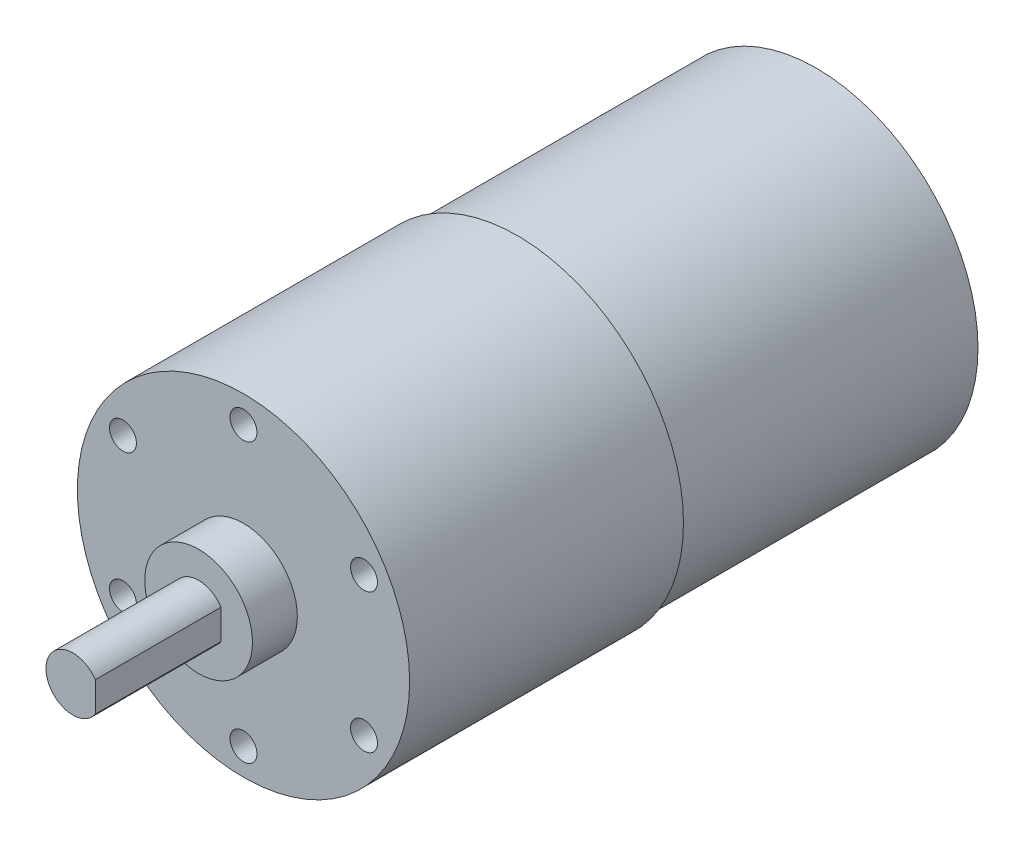
ISO-10303-21;
HEADER;
FILE_DESCRIPTION(('STEP AP214'),'2;1');
FILE_NAME('part.step','',(''),(''),'','','');
FILE_SCHEMA(('AUTOMOTIVE_DESIGN { 1 0 10303 214 1 1 1 1 }'));
ENDSEC;
DATA;
#1=APPLICATION_CONTEXT('core data for automotive mechanical design processes');
#2=APPLICATION_PROTOCOL_DEFINITION('international standard','automotive_design',2000,#1);
#3=PRODUCT_CONTEXT('',#1,'mechanical');
#4=PRODUCT('Part','Part','',(#3));
#5=PRODUCT_RELATED_PRODUCT_CATEGORY('part','',(#4));
#6=PRODUCT_DEFINITION_FORMATION('','',#4);
#7=PRODUCT_DEFINITION_CONTEXT('part definition',#1,'design');
#8=PRODUCT_DEFINITION('design','',#6,#7);
#9=PRODUCT_DEFINITION_SHAPE('','',#8);
#10=(LENGTH_UNIT() NAMED_UNIT(*) SI_UNIT(.MILLI.,.METRE.));
#11=(NAMED_UNIT(*) PLANE_ANGLE_UNIT() SI_UNIT($,.RADIAN.));
#12=(NAMED_UNIT(*) SI_UNIT($,.STERADIAN.) SOLID_ANGLE_UNIT());
#13=UNCERTAINTY_MEASURE_WITH_UNIT(LENGTH_MEASURE(1.E-05),#10,'distance_accuracy_value','');
#14=(GEOMETRIC_REPRESENTATION_CONTEXT(3) GLOBAL_UNCERTAINTY_ASSIGNED_CONTEXT((#13)) GLOBAL_UNIT_ASSIGNED_CONTEXT((#10,
#11,#12)) REPRESENTATION_CONTEXT('',''));
#15=CARTESIAN_POINT('',(0.,0.,0.));
#16=DIRECTION('',(0.,0.,1.));
#17=DIRECTION('',(1.,0.,0.));
#18=AXIS2_PLACEMENT_3D('',#15,#16,#17);
#19=CARTESIAN_POINT('',(0.,0.,0.));
#20=DIRECTION('',(0.,0.,-1.));
#21=DIRECTION('',(-1.,0.,0.));
#22=AXIS2_PLACEMENT_3D('',#19,#20,#21);
#23=PLANE('',#22);
#24=CARTESIAN_POINT('',(0.,0.,0.));
#25=DIRECTION('',(0.,0.,1.));
#26=DIRECTION('',(1.,0.,0.));
#27=AXIS2_PLACEMENT_3D('',#24,#25,#26);
#28=CIRCLE('',#27,3.);
#29=CARTESIAN_POINT('',(2.5,1.6583123951777,0.));
#30=VERTEX_POINT('',#29);
#31=CARTESIAN_POINT('',(2.5,-1.6583123951777,0.));
#32=VERTEX_POINT('',#31);
#33=EDGE_CURVE('E11',#30,#32,#28,.T.);
#34=ORIENTED_EDGE('',*,*,#33,.T.);
#35=DIRECTION('',(0.,1.,0.));
#36=VECTOR('',#35,1.);
#37=CARTESIAN_POINT('',(2.5,-18.5,0.));
#38=LINE('',#37,#36);
#39=EDGE_CURVE('E68',#32,#30,#38,.T.);
#40=ORIENTED_EDGE('',*,*,#39,.T.);
#41=EDGE_LOOP('',(#34,#40));
#42=FACE_BOUND('',#41,.T.);
#43=ADVANCED_FACE('F39',(#42),#23,.F.);
#44=CARTESIAN_POINT('',(0.,0.,0.));
#45=DIRECTION('',(0.,0.,1.));
#46=DIRECTION('',(1.,0.,0.));
#47=AXIS2_PLACEMENT_3D('',#44,#45,#46);
#48=CYLINDRICAL_SURFACE('',#47,3.);
#49=CARTESIAN_POINT('',(0.,0.,-14.));
#50=DIRECTION('',(0.,0.,1.));
#51=DIRECTION('',(1.,0.,0.));
#52=AXIS2_PLACEMENT_3D('',#49,#50,#51);
#53=CIRCLE('',#52,3.);
#54=CARTESIAN_POINT('',(2.5,1.6583123951777,-14.));
#55=VERTEX_POINT('',#54);
#56=CARTESIAN_POINT('',(2.5,-1.6583123951777,-14.));
#57=VERTEX_POINT('',#56);
#58=EDGE_CURVE('E46',#55,#57,#53,.T.);
#59=ORIENTED_EDGE('',*,*,#58,.T.);
#60=DIRECTION('',(0.,0.,1.));
#61=VECTOR('',#60,1.);
#62=CARTESIAN_POINT('',(2.5,-1.6583123951777,0.));
#63=LINE('',#62,#61);
#64=EDGE_CURVE('E66',#57,#32,#63,.T.);
#65=ORIENTED_EDGE('',*,*,#64,.T.);
#66=ORIENTED_EDGE('',*,*,#33,.F.);
#67=DIRECTION('',(0.,0.,1.));
#68=VECTOR('',#67,1.);
#69=CARTESIAN_POINT('',(2.5,1.6583123951777,0.));
#70=LINE('',#69,#68);
#71=EDGE_CURVE('E59',#30,#55,#70,.F.);
#72=ORIENTED_EDGE('',*,*,#71,.T.);
#73=EDGE_LOOP('',(#59,#65,#66,#72));
#74=FACE_BOUND('',#73,.T.);
#75=ADVANCED_FACE('F72',(#74),#48,.T.);
#76=CARTESIAN_POINT('',(0.,3.,-14.));
#77=DIRECTION('',(0.,0.,-1.));
#78=DIRECTION('',(-1.,0.,0.));
#79=AXIS2_PLACEMENT_3D('',#76,#77,#78);
#80=PLANE('',#79);
#81=ORIENTED_EDGE('',*,*,#58,.F.);
#82=DIRECTION('',(0.,1.,0.));
#83=VECTOR('',#82,1.);
#84=CARTESIAN_POINT('',(2.5,-18.5,-14.));
#85=LINE('',#84,#83);
#86=EDGE_CURVE('E52',#57,#55,#85,.T.);
#87=ORIENTED_EDGE('',*,*,#86,.F.);
#88=EDGE_LOOP('',(#81,#87));
#89=FACE_BOUND('',#88,.T.);
#90=CARTESIAN_POINT('',(0.,0.,-14.));
#91=DIRECTION('',(0.,0.,1.));
#92=DIRECTION('',(1.,0.,0.));
#93=AXIS2_PLACEMENT_3D('',#90,#91,#92);
#94=CIRCLE('',#93,6.);
#95=CARTESIAN_POINT('',(6.,0.,-14.));
#96=VERTEX_POINT('',#95);
#97=EDGE_CURVE('E76',#96,#96,#94,.T.);
#98=ORIENTED_EDGE('',*,*,#97,.T.);
#99=EDGE_LOOP('',(#98));
#100=FACE_BOUND('',#99,.T.);
#101=ADVANCED_FACE('F74',(#89,#100),#80,.F.);
#102=CARTESIAN_POINT('',(0.,0.,0.));
#103=DIRECTION('',(0.,0.,1.));
#104=DIRECTION('',(1.,0.,0.));
#105=AXIS2_PLACEMENT_3D('',#102,#103,#104);
#106=CYLINDRICAL_SURFACE('',#105,6.);
#107=ORIENTED_EDGE('',*,*,#97,.F.);
#108=EDGE_LOOP('',(#107));
#109=FACE_BOUND('',#108,.T.);
#110=CARTESIAN_POINT('',(0.,0.,-19.));
#111=DIRECTION('',(0.,0.,1.));
#112=DIRECTION('',(1.,0.,0.));
#113=AXIS2_PLACEMENT_3D('',#110,#111,#112);
#114=CIRCLE('',#113,6.);
#115=CARTESIAN_POINT('',(6.,0.,-19.));
#116=VERTEX_POINT('',#115);
#117=EDGE_CURVE('E78',#116,#116,#114,.T.);
#118=ORIENTED_EDGE('',*,*,#117,.T.);
#119=EDGE_LOOP('',(#118));
#120=FACE_BOUND('',#119,.T.);
#121=ADVANCED_FACE('F140',(#109,#120),#106,.T.);
#122=CARTESIAN_POINT('',(0.,6.,-19.));
#123=DIRECTION('',(0.,0.,-1.));
#124=DIRECTION('',(-1.,0.,0.));
#125=AXIS2_PLACEMENT_3D('',#122,#123,#124);
#126=PLANE('',#125);
#127=CARTESIAN_POINT('',(0.,15.5,-19.));
#128=DIRECTION('',(0.,0.,1.));
#129=DIRECTION('',(1.,0.,0.));
#130=AXIS2_PLACEMENT_3D('',#127,#128,#129);
#131=CIRCLE('',#130,1.5);
#132=CARTESIAN_POINT('',(1.5,15.5,-19.));
#133=VERTEX_POINT('',#132);
#134=EDGE_CURVE('E121',#133,#133,#131,.T.);
#135=ORIENTED_EDGE('',*,*,#134,.F.);
#136=EDGE_LOOP('',(#135));
#137=FACE_BOUND('',#136,.T.);
#138=CARTESIAN_POINT('',(-13.4233937586579,7.74999999999847,-19.));
#139=DIRECTION('',(0.,0.,1.));
#140=DIRECTION('',(1.,0.,0.));
#141=AXIS2_PLACEMENT_3D('',#138,#139,#140);
#142=CIRCLE('',#141,1.50000000000147);
#143=CARTESIAN_POINT('',(-11.9233937586565,7.74999999999847,-19.));
#144=VERTEX_POINT('',#143);
#145=EDGE_CURVE('E122',#144,#144,#142,.T.);
#146=ORIENTED_EDGE('',*,*,#145,.F.);
#147=EDGE_LOOP('',(#146));
#148=FACE_BOUND('',#147,.T.);
#149=CARTESIAN_POINT('',(-13.4233937586562,-7.75000000000153,-19.));
#150=DIRECTION('',(0.,0.,1.));
#151=DIRECTION('',(1.,0.,0.));
#152=AXIS2_PLACEMENT_3D('',#149,#150,#151);
#153=CIRCLE('',#152,1.50000000000311);
#154=CARTESIAN_POINT('',(-11.923393758653,-7.75000000000153,-19.));
#155=VERTEX_POINT('',#154);
#156=EDGE_CURVE('E96',#155,#155,#153,.T.);
#157=ORIENTED_EDGE('',*,*,#156,.F.);
#158=EDGE_LOOP('',(#157));
#159=FACE_BOUND('',#158,.T.);
#160=CARTESIAN_POINT('',(3.51859736175406E-12,-15.5,-19.));
#161=DIRECTION('',(0.,0.,1.));
#162=DIRECTION('',(1.,0.,0.));
#163=AXIS2_PLACEMENT_3D('',#160,#161,#162);
#164=CIRCLE('',#163,1.50000000000347);
#165=CARTESIAN_POINT('',(1.50000000000699,-15.5,-19.));
#166=VERTEX_POINT('',#165);
#167=EDGE_CURVE('E103',#166,#166,#164,.T.);
#168=ORIENTED_EDGE('',*,*,#167,.F.);
#169=EDGE_LOOP('',(#168));
#170=FACE_BOUND('',#169,.T.);
#171=CARTESIAN_POINT('',(13.4233937586614,-7.74999999999847,-19.));
#172=DIRECTION('',(0.,0.,1.));
#173=DIRECTION('',(1.,0.,0.));
#174=AXIS2_PLACEMENT_3D('',#171,#172,#173);
#175=CIRCLE('',#174,1.50000000000215);
#176=CARTESIAN_POINT('',(14.9233937586636,-7.74999999999847,-19.));
#177=VERTEX_POINT('',#176);
#178=EDGE_CURVE('E109',#177,#177,#175,.T.);
#179=ORIENTED_EDGE('',*,*,#178,.F.);
#180=EDGE_LOOP('',(#179));
#181=FACE_BOUND('',#180,.T.);
#182=CARTESIAN_POINT('',(13.4233937586597,7.75000000000153,-19.));
#183=DIRECTION('',(0.,0.,1.));
#184=DIRECTION('',(1.,0.,0.));
#185=AXIS2_PLACEMENT_3D('',#182,#183,#184);
#186=CIRCLE('',#185,1.50000000000044);
#187=CARTESIAN_POINT('',(14.9233937586601,7.75000000000153,-19.));
#188=VERTEX_POINT('',#187);
#189=EDGE_CURVE('E115',#188,#188,#186,.T.);
#190=ORIENTED_EDGE('',*,*,#189,.F.);
#191=EDGE_LOOP('',(#190));
#192=FACE_BOUND('',#191,.T.);
#193=ORIENTED_EDGE('',*,*,#117,.F.);
#194=EDGE_LOOP('',(#193));
#195=FACE_BOUND('',#194,.T.);
#196=CARTESIAN_POINT('',(0.,0.,-19.));
#197=DIRECTION('',(0.,0.,1.));
#198=DIRECTION('',(1.,0.,0.));
#199=AXIS2_PLACEMENT_3D('',#196,#197,#198);
#200=CIRCLE('',#199,18.5);
#201=CARTESIAN_POINT('',(18.5,0.,-19.));
#202=VERTEX_POINT('',#201);
#203=EDGE_CURVE('E83',#202,#202,#200,.T.);
#204=ORIENTED_EDGE('',*,*,#203,.T.);
#205=EDGE_LOOP('',(#204));
#206=FACE_BOUND('',#205,.T.);
#207=ADVANCED_FACE('F145',(#137,#148,#159,#170,#181,#192,#195,#206),#126,.F.);
#208=CARTESIAN_POINT('',(0.,0.,0.));
#209=DIRECTION('',(0.,0.,1.));
#210=DIRECTION('',(1.,0.,0.));
#211=AXIS2_PLACEMENT_3D('',#208,#209,#210);
#212=CYLINDRICAL_SURFACE('',#211,18.5);
#213=ORIENTED_EDGE('',*,*,#203,.F.);
#214=EDGE_LOOP('',(#213));
#215=FACE_BOUND('',#214,.T.);
#216=CARTESIAN_POINT('',(0.,0.,-49.5));
#217=DIRECTION('',(0.,0.,1.));
#218=DIRECTION('',(1.,0.,0.));
#219=AXIS2_PLACEMENT_3D('',#216,#217,#218);
#220=CIRCLE('',#219,18.5);
#221=CARTESIAN_POINT('',(18.5,0.,-49.5));
#222=VERTEX_POINT('',#221);
#223=EDGE_CURVE('E86',#222,#222,#220,.T.);
#224=ORIENTED_EDGE('',*,*,#223,.T.);
#225=EDGE_LOOP('',(#224));
#226=FACE_BOUND('',#225,.T.);
#227=ADVANCED_FACE('F149',(#215,#226),#212,.T.);
#228=CARTESIAN_POINT('',(0.,18.5,-49.5));
#229=DIRECTION('',(0.,0.,1.));
#230=DIRECTION('',(1.,0.,0.));
#231=AXIS2_PLACEMENT_3D('',#228,#229,#230);
#232=PLANE('',#231);
#233=ORIENTED_EDGE('',*,*,#223,.F.);
#234=EDGE_LOOP('',(#233));
#235=FACE_BOUND('',#234,.T.);
#236=CARTESIAN_POINT('',(0.,0.,-49.5));
#237=DIRECTION('',(0.,0.,1.));
#238=DIRECTION('',(1.,0.,0.));
#239=AXIS2_PLACEMENT_3D('',#236,#237,#238);
#240=CIRCLE('',#239,18.);
#241=CARTESIAN_POINT('',(18.,0.,-49.5));
#242=VERTEX_POINT('',#241);
#243=EDGE_CURVE('E89',#242,#242,#240,.T.);
#244=ORIENTED_EDGE('',*,*,#243,.T.);
#245=EDGE_LOOP('',(#244));
#246=FACE_BOUND('',#245,.T.);
#247=ADVANCED_FACE('F153',(#235,#246),#232,.F.);
#248=CARTESIAN_POINT('',(0.,0.,0.));
#249=DIRECTION('',(0.,0.,1.));
#250=DIRECTION('',(1.,0.,0.));
#251=AXIS2_PLACEMENT_3D('',#248,#249,#250);
#252=CYLINDRICAL_SURFACE('',#251,18.);
#253=ORIENTED_EDGE('',*,*,#243,.F.);
#254=EDGE_LOOP('',(#253));
#255=FACE_BOUND('',#254,.T.);
#256=CARTESIAN_POINT('',(0.,0.,-82.8));
#257=DIRECTION('',(0.,0.,1.));
#258=DIRECTION('',(1.,0.,0.));
#259=AXIS2_PLACEMENT_3D('',#256,#257,#258);
#260=CIRCLE('',#259,18.);
#261=CARTESIAN_POINT('',(18.,0.,-82.8));
#262=VERTEX_POINT('',#261);
#263=EDGE_CURVE('E92',#262,#262,#260,.T.);
#264=ORIENTED_EDGE('',*,*,#263,.T.);
#265=EDGE_LOOP('',(#264));
#266=FACE_BOUND('',#265,.T.);
#267=ADVANCED_FACE('F157',(#255,#266),#252,.T.);
#268=CARTESIAN_POINT('',(0.,18.,-82.8));
#269=DIRECTION('',(0.,0.,1.));
#270=DIRECTION('',(1.,0.,0.));
#271=AXIS2_PLACEMENT_3D('',#268,#269,#270);
#272=PLANE('',#271);
#273=ORIENTED_EDGE('',*,*,#263,.F.);
#274=EDGE_LOOP('',(#273));
#275=FACE_BOUND('',#274,.T.);
#276=ADVANCED_FACE('F161',(#275),#272,.F.);
#277=CARTESIAN_POINT('',(13.4233937586597,7.75000000000153,-29.));
#278=DIRECTION('',(0.,0.,1.));
#279=DIRECTION('',(1.,0.,0.));
#280=AXIS2_PLACEMENT_3D('',#277,#278,#279);
#281=CYLINDRICAL_SURFACE('',#280,1.50000000000044);
#282=CARTESIAN_POINT('',(13.4233937586597,7.75000000000153,-29.));
#283=DIRECTION('',(0.,0.,1.));
#284=DIRECTION('',(1.,0.,0.));
#285=AXIS2_PLACEMENT_3D('',#282,#283,#284);
#286=CIRCLE('',#285,1.50000000000044);
#287=CARTESIAN_POINT('',(14.9233937586601,7.75000000000153,-29.));
#288=VERTEX_POINT('',#287);
#289=EDGE_CURVE('E118',#288,#288,#286,.T.);
#290=ORIENTED_EDGE('',*,*,#289,.F.);
#291=EDGE_LOOP('',(#290));
#292=FACE_BOUND('',#291,.T.);
#293=ORIENTED_EDGE('',*,*,#189,.T.);
#294=EDGE_LOOP('',(#293));
#295=FACE_BOUND('',#294,.T.);
#296=ADVANCED_FACE('F165',(#292,#295),#281,.F.);
#297=CARTESIAN_POINT('',(13.4233937586597,7.75000000000153,-29.));
#298=DIRECTION('',(0.,0.,1.));
#299=DIRECTION('',(1.,0.,0.));
#300=AXIS2_PLACEMENT_3D('',#297,#298,#299);
#301=PLANE('',#300);
#302=ORIENTED_EDGE('',*,*,#289,.T.);
#303=EDGE_LOOP('',(#302));
#304=FACE_BOUND('',#303,.T.);
#305=ADVANCED_FACE('F188',(#304),#301,.T.);
#306=CARTESIAN_POINT('',(13.4233937586614,-7.74999999999847,-29.));
#307=DIRECTION('',(0.,0.,1.));
#308=DIRECTION('',(1.,0.,0.));
#309=AXIS2_PLACEMENT_3D('',#306,#307,#308);
#310=CYLINDRICAL_SURFACE('',#309,1.50000000000215);
#311=CARTESIAN_POINT('',(13.4233937586614,-7.74999999999847,-29.));
#312=DIRECTION('',(0.,0.,1.));
#313=DIRECTION('',(1.,0.,0.));
#314=AXIS2_PLACEMENT_3D('',#311,#312,#313);
#315=CIRCLE('',#314,1.50000000000215);
#316=CARTESIAN_POINT('',(14.9233937586636,-7.74999999999847,-29.));
#317=VERTEX_POINT('',#316);
#318=EDGE_CURVE('E112',#317,#317,#315,.T.);
#319=ORIENTED_EDGE('',*,*,#318,.F.);
#320=EDGE_LOOP('',(#319));
#321=FACE_BOUND('',#320,.T.);
#322=ORIENTED_EDGE('',*,*,#178,.T.);
#323=EDGE_LOOP('',(#322));
#324=FACE_BOUND('',#323,.T.);
#325=ADVANCED_FACE('F185',(#321,#324),#310,.F.);
#326=CARTESIAN_POINT('',(13.4233937586614,-7.74999999999847,-29.));
#327=DIRECTION('',(0.,0.,1.));
#328=DIRECTION('',(1.,0.,0.));
#329=AXIS2_PLACEMENT_3D('',#326,#327,#328);
#330=PLANE('',#329);
#331=ORIENTED_EDGE('',*,*,#318,.T.);
#332=EDGE_LOOP('',(#331));
#333=FACE_BOUND('',#332,.T.);
#334=ADVANCED_FACE('F180',(#333),#330,.T.);
#335=CARTESIAN_POINT('',(3.51859736175406E-12,-15.5,-29.));
#336=DIRECTION('',(0.,0.,1.));
#337=DIRECTION('',(1.,0.,0.));
#338=AXIS2_PLACEMENT_3D('',#335,#336,#337);
#339=CYLINDRICAL_SURFACE('',#338,1.50000000000347);
#340=CARTESIAN_POINT('',(3.51859736175406E-12,-15.5,-29.));
#341=DIRECTION('',(0.,0.,1.));
#342=DIRECTION('',(1.,0.,0.));
#343=AXIS2_PLACEMENT_3D('',#340,#341,#342);
#344=CIRCLE('',#343,1.50000000000347);
#345=CARTESIAN_POINT('',(1.50000000000699,-15.5,-29.));
#346=VERTEX_POINT('',#345);
#347=EDGE_CURVE('E106',#346,#346,#344,.T.);
#348=ORIENTED_EDGE('',*,*,#347,.F.);
#349=EDGE_LOOP('',(#348));
#350=FACE_BOUND('',#349,.T.);
#351=ORIENTED_EDGE('',*,*,#167,.T.);
#352=EDGE_LOOP('',(#351));
#353=FACE_BOUND('',#352,.T.);
#354=ADVANCED_FACE('F177',(#350,#353),#339,.F.);
#355=CARTESIAN_POINT('',(3.51859736175406E-12,-15.5,-29.));
#356=DIRECTION('',(0.,0.,1.));
#357=DIRECTION('',(1.,0.,0.));
#358=AXIS2_PLACEMENT_3D('',#355,#356,#357);
#359=PLANE('',#358);
#360=ORIENTED_EDGE('',*,*,#347,.T.);
#361=EDGE_LOOP('',(#360));
#362=FACE_BOUND('',#361,.T.);
#363=ADVANCED_FACE('F171',(#362),#359,.T.);
#364=CARTESIAN_POINT('',(-13.4233937586562,-7.75000000000153,-29.));
#365=DIRECTION('',(0.,0.,1.));
#366=DIRECTION('',(1.,0.,0.));
#367=AXIS2_PLACEMENT_3D('',#364,#365,#366);
#368=CYLINDRICAL_SURFACE('',#367,1.50000000000311);
#369=CARTESIAN_POINT('',(-13.4233937586562,-7.75000000000153,-29.));
#370=DIRECTION('',(0.,0.,1.));
#371=DIRECTION('',(1.,0.,0.));
#372=AXIS2_PLACEMENT_3D('',#369,#370,#371);
#373=CIRCLE('',#372,1.50000000000311);
#374=CARTESIAN_POINT('',(-11.923393758653,-7.75000000000153,-29.));
#375=VERTEX_POINT('',#374);
#376=EDGE_CURVE('E99',#375,#375,#373,.T.);
#377=ORIENTED_EDGE('',*,*,#376,.F.);
#378=EDGE_LOOP('',(#377));
#379=FACE_BOUND('',#378,.T.);
#380=ORIENTED_EDGE('',*,*,#156,.T.);
#381=EDGE_LOOP('',(#380));
#382=FACE_BOUND('',#381,.T.);
#383=ADVANCED_FACE('F167',(#379,#382),#368,.F.);
#384=CARTESIAN_POINT('',(-13.4233937586562,-7.75000000000153,-29.));
#385=DIRECTION('',(0.,0.,1.));
#386=DIRECTION('',(1.,0.,0.));
#387=AXIS2_PLACEMENT_3D('',#384,#385,#386);
#388=PLANE('',#387);
#389=ORIENTED_EDGE('',*,*,#376,.T.);
#390=EDGE_LOOP('',(#389));
#391=FACE_BOUND('',#390,.T.);
#392=ADVANCED_FACE('F170',(#391),#388,.T.);
#393=CARTESIAN_POINT('',(-13.4233937586579,7.74999999999847,-29.));
#394=DIRECTION('',(0.,0.,1.));
#395=DIRECTION('',(1.,0.,0.));
#396=AXIS2_PLACEMENT_3D('',#393,#394,#395);
#397=CYLINDRICAL_SURFACE('',#396,1.50000000000147);
#398=CARTESIAN_POINT('',(-13.4233937586579,7.74999999999847,-29.));
#399=DIRECTION('',(0.,0.,1.));
#400=DIRECTION('',(1.,0.,0.));
#401=AXIS2_PLACEMENT_3D('',#398,#399,#400);
#402=CIRCLE('',#401,1.50000000000147);
#403=CARTESIAN_POINT('',(-11.9233937586565,7.74999999999847,-29.));
#404=VERTEX_POINT('',#403);
#405=EDGE_CURVE('E100',#404,#404,#402,.T.);
#406=ORIENTED_EDGE('',*,*,#405,.F.);
#407=EDGE_LOOP('',(#406));
#408=FACE_BOUND('',#407,.T.);
#409=ORIENTED_EDGE('',*,*,#145,.T.);
#410=EDGE_LOOP('',(#409));
#411=FACE_BOUND('',#410,.T.);
#412=ADVANCED_FACE('F175',(#408,#411),#397,.F.);
#413=CARTESIAN_POINT('',(-13.4233937586579,7.74999999999847,-29.));
#414=DIRECTION('',(0.,0.,1.));
#415=DIRECTION('',(1.,0.,0.));
#416=AXIS2_PLACEMENT_3D('',#413,#414,#415);
#417=PLANE('',#416);
#418=ORIENTED_EDGE('',*,*,#405,.T.);
#419=EDGE_LOOP('',(#418));
#420=FACE_BOUND('',#419,.T.);
#421=ADVANCED_FACE('F201',(#420),#417,.T.);
#422=CARTESIAN_POINT('',(0.,15.5,-29.));
#423=DIRECTION('',(0.,0.,1.));
#424=DIRECTION('',(1.,0.,0.));
#425=AXIS2_PLACEMENT_3D('',#422,#423,#424);
#426=CYLINDRICAL_SURFACE('',#425,1.5);
#427=CARTESIAN_POINT('',(0.,15.5,-29.));
#428=DIRECTION('',(0.,0.,1.));
#429=DIRECTION('',(1.,0.,0.));
#430=AXIS2_PLACEMENT_3D('',#427,#428,#429);
#431=CIRCLE('',#430,1.5);
#432=CARTESIAN_POINT('',(1.5,15.5,-29.));
#433=VERTEX_POINT('',#432);
#434=EDGE_CURVE('E95',#433,#433,#431,.T.);
#435=ORIENTED_EDGE('',*,*,#434,.F.);
#436=EDGE_LOOP('',(#435));
#437=FACE_BOUND('',#436,.T.);
#438=ORIENTED_EDGE('',*,*,#134,.T.);
#439=EDGE_LOOP('',(#438));
#440=FACE_BOUND('',#439,.T.);
#441=ADVANCED_FACE('F205',(#437,#440),#426,.F.);
#442=CARTESIAN_POINT('',(0.,15.5,-29.));
#443=DIRECTION('',(0.,0.,1.));
#444=DIRECTION('',(1.,0.,0.));
#445=AXIS2_PLACEMENT_3D('',#442,#443,#444);
#446=PLANE('',#445);
#447=ORIENTED_EDGE('',*,*,#434,.T.);
#448=EDGE_LOOP('',(#447));
#449=FACE_BOUND('',#448,.T.);
#450=ADVANCED_FACE('F209',(#449),#446,.T.);
#451=CARTESIAN_POINT('',(2.5,-18.5,-14.));
#452=DIRECTION('',(-1.,0.,0.));
#453=DIRECTION('',(0.,0.,1.));
#454=AXIS2_PLACEMENT_3D('',#451,#452,#453);
#455=PLANE('',#454);
#456=ORIENTED_EDGE('',*,*,#86,.T.);
#457=ORIENTED_EDGE('',*,*,#71,.F.);
#458=ORIENTED_EDGE('',*,*,#39,.F.);
#459=ORIENTED_EDGE('',*,*,#64,.F.);
#460=EDGE_LOOP('',(#456,#457,#458,#459));
#461=FACE_BOUND('',#460,.T.);
#462=ADVANCED_FACE('F64',(#461),#455,.F.);
#463=CLOSED_SHELL('',(#43,#75,#101,#121,#207,#227,#247,#267,#276,#296,#305,#325,#334,#354,#363,
#383,#392,#412,#421,#441,#450,#462));
#464=MANIFOLD_SOLID_BREP('B2',#463);
#465=ADVANCED_BREP_SHAPE_REPRESENTATION('',(#18,#464),#14);
#466=SHAPE_DEFINITION_REPRESENTATION(#9,#465);
ENDSEC;
END-ISO-10303-21;
